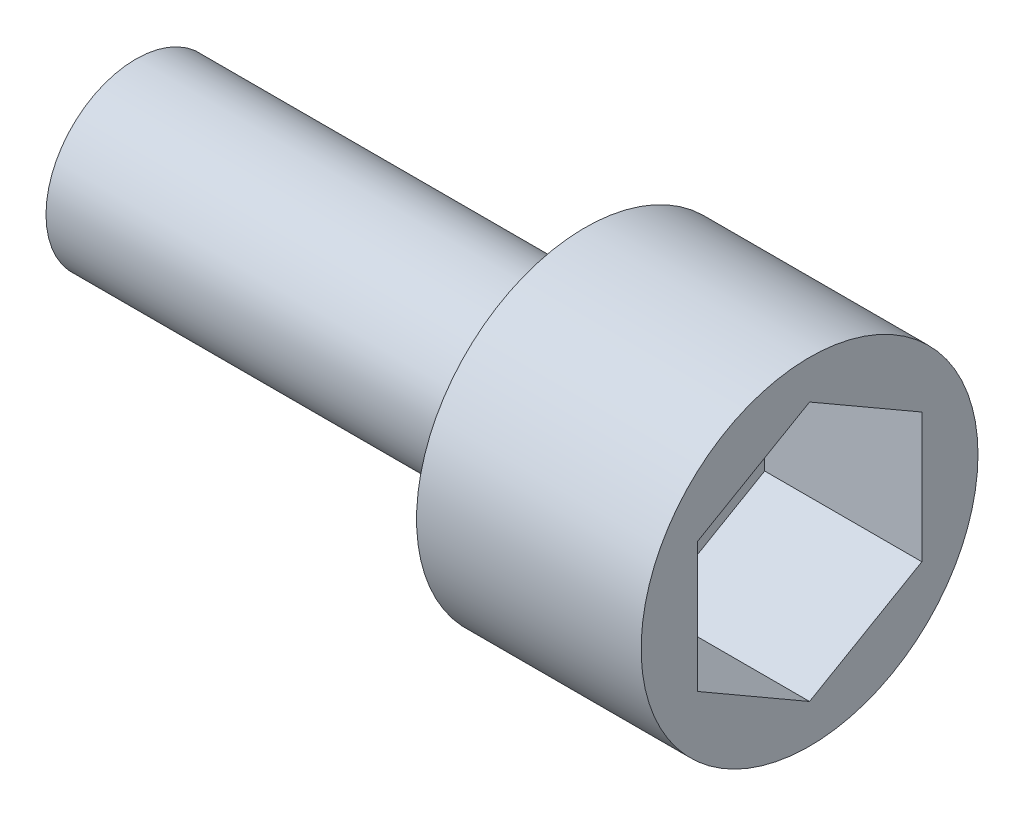
ISO-10303-21;
HEADER;
FILE_DESCRIPTION(('STEP AP214'),'2;1');
FILE_NAME('part.step','',(''),(''),'','','');
FILE_SCHEMA(('AUTOMOTIVE_DESIGN { 1 0 10303 214 1 1 1 1 }'));
ENDSEC;
DATA;
#1=APPLICATION_CONTEXT('core data for automotive mechanical design processes');
#2=APPLICATION_PROTOCOL_DEFINITION('international standard','automotive_design',2000,#1);
#3=PRODUCT_CONTEXT('',#1,'mechanical');
#4=PRODUCT('Part','Part','',(#3));
#5=PRODUCT_RELATED_PRODUCT_CATEGORY('part','',(#4));
#6=PRODUCT_DEFINITION_FORMATION('','',#4);
#7=PRODUCT_DEFINITION_CONTEXT('part definition',#1,'design');
#8=PRODUCT_DEFINITION('design','',#6,#7);
#9=PRODUCT_DEFINITION_SHAPE('','',#8);
#10=(LENGTH_UNIT() NAMED_UNIT(*) SI_UNIT(.MILLI.,.METRE.));
#11=(NAMED_UNIT(*) PLANE_ANGLE_UNIT() SI_UNIT($,.RADIAN.));
#12=(NAMED_UNIT(*) SI_UNIT($,.STERADIAN.) SOLID_ANGLE_UNIT());
#13=UNCERTAINTY_MEASURE_WITH_UNIT(LENGTH_MEASURE(1.E-05),#10,'distance_accuracy_value','');
#14=(GEOMETRIC_REPRESENTATION_CONTEXT(3) GLOBAL_UNCERTAINTY_ASSIGNED_CONTEXT((#13)) GLOBAL_UNIT_ASSIGNED_CONTEXT((#10,
#11,#12)) REPRESENTATION_CONTEXT('',''));
#15=CARTESIAN_POINT('',(0.,0.,0.));
#16=DIRECTION('',(0.,0.,1.));
#17=DIRECTION('',(1.,0.,0.));
#18=AXIS2_PLACEMENT_3D('',#15,#16,#17);
#19=CARTESIAN_POINT('',(10.,0.,0.));
#20=DIRECTION('',(-1.,0.,0.));
#21=DIRECTION('',(0.,0.,1.));
#22=AXIS2_PLACEMENT_3D('',#19,#20,#21);
#23=CYLINDRICAL_SURFACE('',#22,7.5);
#24=CARTESIAN_POINT('',(10.,0.,0.));
#25=DIRECTION('',(1.,0.,0.));
#26=DIRECTION('',(0.,0.,-1.));
#27=AXIS2_PLACEMENT_3D('',#24,#25,#26);
#28=CIRCLE('',#27,7.5);
#29=CARTESIAN_POINT('',(10.,0.,-7.5));
#30=VERTEX_POINT('',#29);
#31=EDGE_CURVE('E54',#30,#30,#28,.T.);
#32=ORIENTED_EDGE('',*,*,#31,.F.);
#33=EDGE_LOOP('',(#32));
#34=FACE_BOUND('',#33,.T.);
#35=CARTESIAN_POINT('',(0.,0.,0.));
#36=DIRECTION('',(1.,0.,0.));
#37=DIRECTION('',(0.,0.,-1.));
#38=AXIS2_PLACEMENT_3D('',#35,#36,#37);
#39=CIRCLE('',#38,7.5);
#40=CARTESIAN_POINT('',(0.,0.,-7.5));
#41=VERTEX_POINT('',#40);
#42=EDGE_CURVE('E48',#41,#41,#39,.T.);
#43=ORIENTED_EDGE('',*,*,#42,.T.);
#44=EDGE_LOOP('',(#43));
#45=FACE_BOUND('',#44,.T.);
#46=ADVANCED_FACE('F45',(#34,#45),#23,.T.);
#47=CARTESIAN_POINT('',(10.,0.,0.));
#48=DIRECTION('',(1.,0.,0.));
#49=DIRECTION('',(0.,0.,-1.));
#50=AXIS2_PLACEMENT_3D('',#47,#48,#49);
#51=PLANE('',#50);
#52=DIRECTION('',(0.,0.5,0.866025403784439));
#53=VECTOR('',#52,1.);
#54=CARTESIAN_POINT('',(10.,2.88675134594813,-5.));
#55=LINE('',#54,#53);
#56=CARTESIAN_POINT('',(10.,2.88675134594813,-5.));
#57=VERTEX_POINT('',#56);
#58=CARTESIAN_POINT('',(10.,5.77350269189626,0.));
#59=VERTEX_POINT('',#58);
#60=EDGE_CURVE('E62',#57,#59,#55,.T.);
#61=ORIENTED_EDGE('',*,*,#60,.F.);
#62=DIRECTION('',(0.,1.,0.));
#63=VECTOR('',#62,1.);
#64=CARTESIAN_POINT('',(10.,-2.88675134594813,-5.));
#65=LINE('',#64,#63);
#66=CARTESIAN_POINT('',(10.,-2.88675134594813,-5.));
#67=VERTEX_POINT('',#66);
#68=EDGE_CURVE('E156',#67,#57,#65,.T.);
#69=ORIENTED_EDGE('',*,*,#68,.F.);
#70=DIRECTION('',(0.,0.5,-0.866025403784438));
#71=VECTOR('',#70,1.);
#72=CARTESIAN_POINT('',(10.,-5.77350269189626,0.));
#73=LINE('',#72,#71);
#74=CARTESIAN_POINT('',(10.,-5.77350269189626,0.));
#75=VERTEX_POINT('',#74);
#76=EDGE_CURVE('E153',#75,#67,#73,.T.);
#77=ORIENTED_EDGE('',*,*,#76,.F.);
#78=DIRECTION('',(0.,-0.5,-0.866025403784439));
#79=VECTOR('',#78,1.);
#80=CARTESIAN_POINT('',(10.,-2.88675134594813,5.));
#81=LINE('',#80,#79);
#82=CARTESIAN_POINT('',(10.,-2.88675134594813,5.));
#83=VERTEX_POINT('',#82);
#84=EDGE_CURVE('E110',#83,#75,#81,.T.);
#85=ORIENTED_EDGE('',*,*,#84,.F.);
#86=DIRECTION('',(0.,-1.,0.));
#87=VECTOR('',#86,1.);
#88=CARTESIAN_POINT('',(10.,2.88675134594813,5.));
#89=LINE('',#88,#87);
#90=CARTESIAN_POINT('',(10.,2.88675134594813,5.));
#91=VERTEX_POINT('',#90);
#92=EDGE_CURVE('E147',#91,#83,#89,.T.);
#93=ORIENTED_EDGE('',*,*,#92,.F.);
#94=DIRECTION('',(0.,-0.5,0.866025403784438));
#95=VECTOR('',#94,1.);
#96=CARTESIAN_POINT('',(10.,5.77350269189626,0.));
#97=LINE('',#96,#95);
#98=EDGE_CURVE('E142',#59,#91,#97,.T.);
#99=ORIENTED_EDGE('',*,*,#98,.F.);
#100=EDGE_LOOP('',(#61,#69,#77,#85,#93,#99));
#101=FACE_BOUND('',#100,.T.);
#102=ORIENTED_EDGE('',*,*,#31,.T.);
#103=EDGE_LOOP('',(#102));
#104=FACE_BOUND('',#103,.T.);
#105=ADVANCED_FACE('F182',(#101,#104),#51,.T.);
#106=CARTESIAN_POINT('',(0.,0.,0.));
#107=DIRECTION('',(1.,0.,0.));
#108=DIRECTION('',(0.,0.,-1.));
#109=AXIS2_PLACEMENT_3D('',#106,#107,#108);
#110=PLANE('',#109);
#111=CARTESIAN_POINT('',(0.,0.,0.));
#112=DIRECTION('',(-1.,0.,0.));
#113=DIRECTION('',(0.,0.,1.));
#114=AXIS2_PLACEMENT_3D('',#111,#112,#113);
#115=CIRCLE('',#114,4.);
#116=CARTESIAN_POINT('',(0.,0.,4.));
#117=VERTEX_POINT('',#116);
#118=EDGE_CURVE('E11',#117,#117,#115,.T.);
#119=ORIENTED_EDGE('',*,*,#118,.F.);
#120=EDGE_LOOP('',(#119));
#121=FACE_BOUND('',#120,.T.);
#122=ORIENTED_EDGE('',*,*,#42,.F.);
#123=EDGE_LOOP('',(#122));
#124=FACE_BOUND('',#123,.T.);
#125=ADVANCED_FACE('F179',(#121,#124),#110,.F.);
#126=CARTESIAN_POINT('',(3.,2.88675134594813,-5.));
#127=DIRECTION('',(0.,0.866025403784439,-0.5));
#128=DIRECTION('',(0.,0.5,0.866025403784439));
#129=AXIS2_PLACEMENT_3D('',#126,#127,#128);
#130=PLANE('',#129);
#131=ORIENTED_EDGE('',*,*,#60,.T.);
#132=DIRECTION('',(1.,0.,0.));
#133=VECTOR('',#132,1.);
#134=CARTESIAN_POINT('',(3.,5.77350269189626,0.));
#135=LINE('',#134,#133);
#136=CARTESIAN_POINT('',(3.,5.77350269189626,0.));
#137=VERTEX_POINT('',#136);
#138=EDGE_CURVE('E92',#137,#59,#135,.T.);
#139=ORIENTED_EDGE('',*,*,#138,.F.);
#140=DIRECTION('',(0.,0.5,0.866025403784439));
#141=VECTOR('',#140,1.);
#142=CARTESIAN_POINT('',(3.,2.88675134594813,-5.));
#143=LINE('',#142,#141);
#144=CARTESIAN_POINT('',(3.,2.88675134594813,-5.));
#145=VERTEX_POINT('',#144);
#146=EDGE_CURVE('E159',#145,#137,#143,.T.);
#147=ORIENTED_EDGE('',*,*,#146,.F.);
#148=DIRECTION('',(1.,0.,0.));
#149=VECTOR('',#148,1.);
#150=CARTESIAN_POINT('',(3.,2.88675134594813,-5.));
#151=LINE('',#150,#149);
#152=EDGE_CURVE('E70',#145,#57,#151,.T.);
#153=ORIENTED_EDGE('',*,*,#152,.T.);
#154=EDGE_LOOP('',(#131,#139,#147,#153));
#155=FACE_BOUND('',#154,.T.);
#156=ADVANCED_FACE('F181',(#155),#130,.F.);
#157=CARTESIAN_POINT('',(3.,-2.88675134594813,-5.));
#158=DIRECTION('',(0.,0.,-1.));
#159=DIRECTION('',(0.,1.,0.));
#160=AXIS2_PLACEMENT_3D('',#157,#158,#159);
#161=PLANE('',#160);
#162=ORIENTED_EDGE('',*,*,#68,.T.);
#163=ORIENTED_EDGE('',*,*,#152,.F.);
#164=DIRECTION('',(0.,1.,0.));
#165=VECTOR('',#164,1.);
#166=CARTESIAN_POINT('',(3.,-2.88675134594813,-5.));
#167=LINE('',#166,#165);
#168=CARTESIAN_POINT('',(3.,-2.88675134594813,-5.));
#169=VERTEX_POINT('',#168);
#170=EDGE_CURVE('E124',#169,#145,#167,.T.);
#171=ORIENTED_EDGE('',*,*,#170,.F.);
#172=DIRECTION('',(1.,0.,0.));
#173=VECTOR('',#172,1.);
#174=CARTESIAN_POINT('',(3.,-2.88675134594813,-5.));
#175=LINE('',#174,#173);
#176=EDGE_CURVE('E115',#169,#67,#175,.T.);
#177=ORIENTED_EDGE('',*,*,#176,.T.);
#178=EDGE_LOOP('',(#162,#163,#171,#177));
#179=FACE_BOUND('',#178,.T.);
#180=ADVANCED_FACE('F189',(#179),#161,.F.);
#181=CARTESIAN_POINT('',(3.,-5.77350269189626,0.));
#182=DIRECTION('',(0.,-0.866025403784438,-0.5));
#183=DIRECTION('',(0.,0.5,-0.866025403784438));
#184=AXIS2_PLACEMENT_3D('',#181,#182,#183);
#185=PLANE('',#184);
#186=ORIENTED_EDGE('',*,*,#76,.T.);
#187=ORIENTED_EDGE('',*,*,#176,.F.);
#188=DIRECTION('',(0.,0.5,-0.866025403784438));
#189=VECTOR('',#188,1.);
#190=CARTESIAN_POINT('',(3.,-5.77350269189626,0.));
#191=LINE('',#190,#189);
#192=CARTESIAN_POINT('',(3.,-5.77350269189626,0.));
#193=VERTEX_POINT('',#192);
#194=EDGE_CURVE('E119',#193,#169,#191,.T.);
#195=ORIENTED_EDGE('',*,*,#194,.F.);
#196=DIRECTION('',(1.,0.,0.));
#197=VECTOR('',#196,1.);
#198=CARTESIAN_POINT('',(3.,-5.77350269189626,0.));
#199=LINE('',#198,#197);
#200=EDGE_CURVE('E103',#193,#75,#199,.T.);
#201=ORIENTED_EDGE('',*,*,#200,.T.);
#202=EDGE_LOOP('',(#186,#187,#195,#201));
#203=FACE_BOUND('',#202,.T.);
#204=ADVANCED_FACE('F120',(#203),#185,.F.);
#205=CARTESIAN_POINT('',(3.,-2.88675134594813,5.));
#206=DIRECTION('',(0.,-0.866025403784438,0.5));
#207=DIRECTION('',(0.,-0.5,-0.866025403784439));
#208=AXIS2_PLACEMENT_3D('',#205,#206,#207);
#209=PLANE('',#208);
#210=ORIENTED_EDGE('',*,*,#84,.T.);
#211=ORIENTED_EDGE('',*,*,#200,.F.);
#212=DIRECTION('',(0.,-0.5,-0.866025403784439));
#213=VECTOR('',#212,1.);
#214=CARTESIAN_POINT('',(3.,-2.88675134594813,5.));
#215=LINE('',#214,#213);
#216=CARTESIAN_POINT('',(3.,-2.88675134594813,5.));
#217=VERTEX_POINT('',#216);
#218=EDGE_CURVE('E107',#217,#193,#215,.T.);
#219=ORIENTED_EDGE('',*,*,#218,.F.);
#220=DIRECTION('',(1.,0.,0.));
#221=VECTOR('',#220,1.);
#222=CARTESIAN_POINT('',(3.,-2.88675134594813,5.));
#223=LINE('',#222,#221);
#224=EDGE_CURVE('E116',#217,#83,#223,.T.);
#225=ORIENTED_EDGE('',*,*,#224,.T.);
#226=EDGE_LOOP('',(#210,#211,#219,#225));
#227=FACE_BOUND('',#226,.T.);
#228=ADVANCED_FACE('F105',(#227),#209,.F.);
#229=CARTESIAN_POINT('',(3.,2.88675134594813,5.));
#230=DIRECTION('',(0.,0.,1.));
#231=DIRECTION('',(0.,-1.,0.));
#232=AXIS2_PLACEMENT_3D('',#229,#230,#231);
#233=PLANE('',#232);
#234=ORIENTED_EDGE('',*,*,#92,.T.);
#235=ORIENTED_EDGE('',*,*,#224,.F.);
#236=DIRECTION('',(0.,-1.,0.));
#237=VECTOR('',#236,1.);
#238=CARTESIAN_POINT('',(3.,2.88675134594813,5.));
#239=LINE('',#238,#237);
#240=CARTESIAN_POINT('',(3.,2.88675134594813,5.));
#241=VERTEX_POINT('',#240);
#242=EDGE_CURVE('E130',#241,#217,#239,.T.);
#243=ORIENTED_EDGE('',*,*,#242,.F.);
#244=DIRECTION('',(1.,0.,0.));
#245=VECTOR('',#244,1.);
#246=CARTESIAN_POINT('',(3.,2.88675134594813,5.));
#247=LINE('',#246,#245);
#248=EDGE_CURVE('E166',#241,#91,#247,.T.);
#249=ORIENTED_EDGE('',*,*,#248,.T.);
#250=EDGE_LOOP('',(#234,#235,#243,#249));
#251=FACE_BOUND('',#250,.T.);
#252=ADVANCED_FACE('F230',(#251),#233,.F.);
#253=CARTESIAN_POINT('',(3.,5.77350269189626,0.));
#254=DIRECTION('',(0.,0.866025403784438,0.5));
#255=DIRECTION('',(0.,-0.5,0.866025403784439));
#256=AXIS2_PLACEMENT_3D('',#253,#254,#255);
#257=PLANE('',#256);
#258=ORIENTED_EDGE('',*,*,#98,.T.);
#259=ORIENTED_EDGE('',*,*,#248,.F.);
#260=DIRECTION('',(0.,-0.5,0.866025403784438));
#261=VECTOR('',#260,1.);
#262=CARTESIAN_POINT('',(3.,5.77350269189626,0.));
#263=LINE('',#262,#261);
#264=EDGE_CURVE('E134',#137,#241,#263,.T.);
#265=ORIENTED_EDGE('',*,*,#264,.F.);
#266=ORIENTED_EDGE('',*,*,#138,.T.);
#267=EDGE_LOOP('',(#258,#259,#265,#266));
#268=FACE_BOUND('',#267,.T.);
#269=ADVANCED_FACE('F238',(#268),#257,.F.);
#270=CARTESIAN_POINT('',(3.,0.,0.));
#271=DIRECTION('',(1.,0.,0.));
#272=DIRECTION('',(0.,0.,-1.));
#273=AXIS2_PLACEMENT_3D('',#270,#271,#272);
#274=PLANE('',#273);
#275=ORIENTED_EDGE('',*,*,#146,.T.);
#276=ORIENTED_EDGE('',*,*,#264,.T.);
#277=ORIENTED_EDGE('',*,*,#242,.T.);
#278=ORIENTED_EDGE('',*,*,#218,.T.);
#279=ORIENTED_EDGE('',*,*,#194,.T.);
#280=ORIENTED_EDGE('',*,*,#170,.T.);
#281=EDGE_LOOP('',(#275,#276,#277,#278,#279,#280));
#282=FACE_BOUND('',#281,.T.);
#283=ADVANCED_FACE('F127',(#282),#274,.T.);
#284=CARTESIAN_POINT('',(-20.,0.,0.));
#285=DIRECTION('',(1.,0.,0.));
#286=DIRECTION('',(0.,0.,-1.));
#287=AXIS2_PLACEMENT_3D('',#284,#285,#286);
#288=CYLINDRICAL_SURFACE('',#287,4.);
#289=CARTESIAN_POINT('',(-20.,0.,0.));
#290=DIRECTION('',(-1.,0.,0.));
#291=DIRECTION('',(0.,0.,1.));
#292=AXIS2_PLACEMENT_3D('',#289,#290,#291);
#293=CIRCLE('',#292,4.);
#294=CARTESIAN_POINT('',(-20.,0.,4.));
#295=VERTEX_POINT('',#294);
#296=EDGE_CURVE('E143',#295,#295,#293,.T.);
#297=ORIENTED_EDGE('',*,*,#296,.F.);
#298=EDGE_LOOP('',(#297));
#299=FACE_BOUND('',#298,.T.);
#300=ORIENTED_EDGE('',*,*,#118,.T.);
#301=EDGE_LOOP('',(#300));
#302=FACE_BOUND('',#301,.T.);
#303=ADVANCED_FACE('F253',(#299,#302),#288,.T.);
#304=CARTESIAN_POINT('',(-20.,0.,0.));
#305=DIRECTION('',(-1.,0.,0.));
#306=DIRECTION('',(0.,0.,1.));
#307=AXIS2_PLACEMENT_3D('',#304,#305,#306);
#308=PLANE('',#307);
#309=ORIENTED_EDGE('',*,*,#296,.T.);
#310=EDGE_LOOP('',(#309));
#311=FACE_BOUND('',#310,.T.);
#312=ADVANCED_FACE('F264',(#311),#308,.T.);
#313=CLOSED_SHELL('',(#46,#105,#125,#156,#180,#204,#228,#252,#269,#283,#303,#312));
#314=MANIFOLD_SOLID_BREP('B2',#313);
#315=ADVANCED_BREP_SHAPE_REPRESENTATION('',(#18,#314),#14);
#316=SHAPE_DEFINITION_REPRESENTATION(#9,#315);
ENDSEC;
END-ISO-10303-21;
